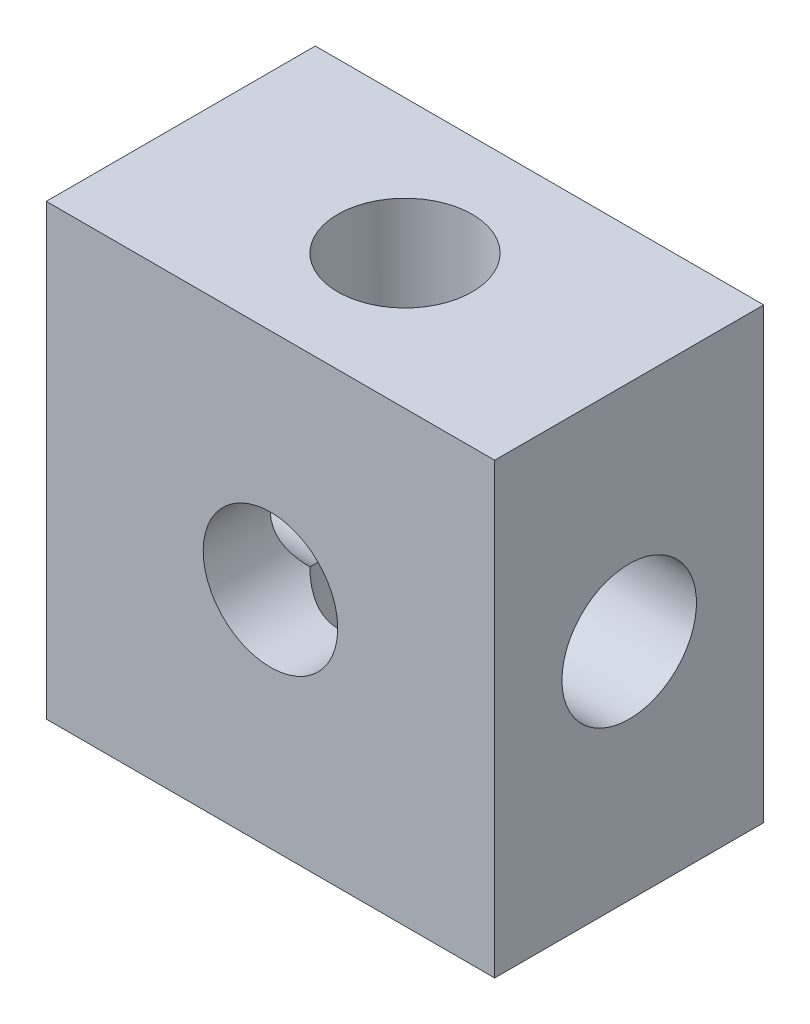
ISO-10303-21;
HEADER;
FILE_DESCRIPTION(('STEP AP214'),'2;1');
FILE_NAME('part.step','',(''),(''),'','','');
FILE_SCHEMA(('AUTOMOTIVE_DESIGN { 1 0 10303 214 1 1 1 1 }'));
ENDSEC;
DATA;
#1=APPLICATION_CONTEXT('core data for automotive mechanical design processes');
#2=APPLICATION_PROTOCOL_DEFINITION('international standard','automotive_design',2000,#1);
#3=PRODUCT_CONTEXT('',#1,'mechanical');
#4=PRODUCT('Part','Part','',(#3));
#5=PRODUCT_RELATED_PRODUCT_CATEGORY('part','',(#4));
#6=PRODUCT_DEFINITION_FORMATION('','',#4);
#7=PRODUCT_DEFINITION_CONTEXT('part definition',#1,'design');
#8=PRODUCT_DEFINITION('design','',#6,#7);
#9=PRODUCT_DEFINITION_SHAPE('','',#8);
#10=(LENGTH_UNIT() NAMED_UNIT(*) SI_UNIT(.MILLI.,.METRE.));
#11=(NAMED_UNIT(*) PLANE_ANGLE_UNIT() SI_UNIT($,.RADIAN.));
#12=(NAMED_UNIT(*) SI_UNIT($,.STERADIAN.) SOLID_ANGLE_UNIT());
#13=UNCERTAINTY_MEASURE_WITH_UNIT(LENGTH_MEASURE(1.E-05),#10,'distance_accuracy_value','');
#14=(GEOMETRIC_REPRESENTATION_CONTEXT(3) GLOBAL_UNCERTAINTY_ASSIGNED_CONTEXT((#13)) GLOBAL_UNIT_ASSIGNED_CONTEXT((#10,
#11,#12)) REPRESENTATION_CONTEXT('',''));
#15=CARTESIAN_POINT('',(0.,0.,0.));
#16=DIRECTION('',(0.,0.,1.));
#17=DIRECTION('',(1.,0.,0.));
#18=AXIS2_PLACEMENT_3D('',#15,#16,#17);
#19=CARTESIAN_POINT('',(5.,5.,6.));
#20=DIRECTION('',(0.,0.,-1.));
#21=DIRECTION('',(-1.,0.,0.));
#22=AXIS2_PLACEMENT_3D('',#19,#20,#21);
#23=CYLINDRICAL_SURFACE('',#22,1.5);
#24=CARTESIAN_POINT('',(5.,5.,0.));
#25=DIRECTION('',(0.,0.,-1.));
#26=DIRECTION('',(-1.,0.,0.));
#27=AXIS2_PLACEMENT_3D('',#24,#25,#26);
#28=CIRCLE('',#27,1.5);
#29=CARTESIAN_POINT('',(3.5,5.,0.));
#30=VERTEX_POINT('',#29);
#31=EDGE_CURVE('E155',#30,#30,#28,.T.);
#32=ORIENTED_EDGE('',*,*,#31,.T.);
#33=EDGE_LOOP('',(#32));
#34=FACE_BOUND('',#33,.T.);
#35=CARTESIAN_POINT('',(5.,5.,3.));
#36=DIRECTION('',(0.,0.707106781186547,-0.707106781186548));
#37=DIRECTION('',(0.,-0.707106781186547,-0.707106781186548));
#38=AXIS2_PLACEMENT_3D('',#35,#36,#37);
#39=ELLIPSE('',#38,2.12132034355964,1.5);
#40=CARTESIAN_POINT('',(3.93933982822018,3.93933982822018,1.93933982822018));
#41=VERTEX_POINT('',#40);
#42=CARTESIAN_POINT('',(6.06066017177982,3.93933982822018,1.93933982822018));
#43=VERTEX_POINT('',#42);
#44=EDGE_CURVE('E110',#41,#43,#39,.F.);
#45=ORIENTED_EDGE('',*,*,#44,.T.);
#46=CARTESIAN_POINT('',(5.,5.,3.));
#47=DIRECTION('',(-0.707106781186547,0.,-0.707106781186547));
#48=DIRECTION('',(0.707106781186547,0.,-0.707106781186547));
#49=AXIS2_PLACEMENT_3D('',#46,#47,#48);
#50=ELLIPSE('',#49,2.12132034355964,1.5);
#51=CARTESIAN_POINT('',(6.06066017177982,6.06066017177982,1.93933982822018));
#52=VERTEX_POINT('',#51);
#53=EDGE_CURVE('E55',#43,#52,#50,.F.);
#54=ORIENTED_EDGE('',*,*,#53,.T.);
#55=CARTESIAN_POINT('',(5.,5.,3.));
#56=DIRECTION('',(0.,-0.707106781186547,-0.707106781186548));
#57=DIRECTION('',(0.,0.707106781186547,-0.707106781186548));
#58=AXIS2_PLACEMENT_3D('',#55,#56,#57);
#59=ELLIPSE('',#58,2.12132034355964,1.5);
#60=CARTESIAN_POINT('',(3.93933982822018,6.06066017177982,1.93933982822018));
#61=VERTEX_POINT('',#60);
#62=EDGE_CURVE('E124',#52,#61,#59,.F.);
#63=ORIENTED_EDGE('',*,*,#62,.T.);
#64=CARTESIAN_POINT('',(5.,5.,3.));
#65=DIRECTION('',(0.707106781186547,0.,-0.707106781186547));
#66=DIRECTION('',(-0.707106781186547,0.,-0.707106781186547));
#67=AXIS2_PLACEMENT_3D('',#64,#65,#66);
#68=ELLIPSE('',#67,2.12132034355964,1.5);
#69=EDGE_CURVE('E138',#61,#41,#68,.F.);
#70=ORIENTED_EDGE('',*,*,#69,.T.);
#71=EDGE_LOOP('',(#45,#54,#63,#70));
#72=FACE_BOUND('',#71,.T.);
#73=ADVANCED_FACE('F39',(#34,#72),#23,.F.);
#74=CARTESIAN_POINT('',(0.,10.,6.));
#75=DIRECTION('',(1.,0.,0.));
#76=DIRECTION('',(0.,0.,-1.));
#77=AXIS2_PLACEMENT_3D('',#74,#75,#76);
#78=PLANE('',#77);
#79=CARTESIAN_POINT('',(0.,5.,3.));
#80=DIRECTION('',(-1.,0.,0.));
#81=DIRECTION('',(0.,0.,1.));
#82=AXIS2_PLACEMENT_3D('',#79,#80,#81);
#83=CIRCLE('',#82,1.5);
#84=CARTESIAN_POINT('',(0.,5.,4.5));
#85=VERTEX_POINT('',#84);
#86=EDGE_CURVE('E266',#85,#85,#83,.T.);
#87=ORIENTED_EDGE('',*,*,#86,.F.);
#88=EDGE_LOOP('',(#87));
#89=FACE_BOUND('',#88,.T.);
#90=DIRECTION('',(0.,-1.,0.));
#91=VECTOR('',#90,1.);
#92=CARTESIAN_POINT('',(0.,10.,0.));
#93=LINE('',#92,#91);
#94=CARTESIAN_POINT('',(0.,10.,0.));
#95=VERTEX_POINT('',#94);
#96=CARTESIAN_POINT('',(0.,0.,0.));
#97=VERTEX_POINT('',#96);
#98=EDGE_CURVE('E163',#95,#97,#93,.T.);
#99=ORIENTED_EDGE('',*,*,#98,.T.);
#100=DIRECTION('',(0.,0.,-1.));
#101=VECTOR('',#100,1.);
#102=CARTESIAN_POINT('',(0.,0.,6.));
#103=LINE('',#102,#101);
#104=CARTESIAN_POINT('',(0.,0.,6.));
#105=VERTEX_POINT('',#104);
#106=EDGE_CURVE('E130',#105,#97,#103,.T.);
#107=ORIENTED_EDGE('',*,*,#106,.F.);
#108=DIRECTION('',(0.,-1.,0.));
#109=VECTOR('',#108,1.);
#110=CARTESIAN_POINT('',(0.,10.,6.));
#111=LINE('',#110,#109);
#112=CARTESIAN_POINT('',(0.,10.,6.));
#113=VERTEX_POINT('',#112);
#114=EDGE_CURVE('E167',#113,#105,#111,.T.);
#115=ORIENTED_EDGE('',*,*,#114,.F.);
#116=DIRECTION('',(0.,0.,-1.));
#117=VECTOR('',#116,1.);
#118=CARTESIAN_POINT('',(0.,10.,6.));
#119=LINE('',#118,#117);
#120=EDGE_CURVE('E181',#113,#95,#119,.T.);
#121=ORIENTED_EDGE('',*,*,#120,.T.);
#122=EDGE_LOOP('',(#99,#107,#115,#121));
#123=FACE_BOUND('',#122,.T.);
#124=ADVANCED_FACE('F41',(#89,#123),#78,.F.);
#125=CARTESIAN_POINT('',(0.,0.,6.));
#126=DIRECTION('',(0.,1.,0.));
#127=DIRECTION('',(0.,0.,1.));
#128=AXIS2_PLACEMENT_3D('',#125,#126,#127);
#129=PLANE('',#128);
#130=CARTESIAN_POINT('',(5.,0.,3.));
#131=DIRECTION('',(0.,1.,0.));
#132=DIRECTION('',(-1.,0.,0.));
#133=AXIS2_PLACEMENT_3D('',#130,#131,#132);
#134=CIRCLE('',#133,1.5);
#135=CARTESIAN_POINT('',(3.5,0.,3.));
#136=VERTEX_POINT('',#135);
#137=EDGE_CURVE('E151',#136,#136,#134,.T.);
#138=ORIENTED_EDGE('',*,*,#137,.T.);
#139=EDGE_LOOP('',(#138));
#140=FACE_BOUND('',#139,.T.);
#141=DIRECTION('',(1.,0.,0.));
#142=VECTOR('',#141,1.);
#143=CARTESIAN_POINT('',(0.,0.,0.));
#144=LINE('',#143,#142);
#145=CARTESIAN_POINT('',(10.,0.,0.));
#146=VERTEX_POINT('',#145);
#147=EDGE_CURVE('E185',#97,#146,#144,.T.);
#148=ORIENTED_EDGE('',*,*,#147,.T.);
#149=DIRECTION('',(0.,0.,-1.));
#150=VECTOR('',#149,1.);
#151=CARTESIAN_POINT('',(10.,0.,6.));
#152=LINE('',#151,#150);
#153=CARTESIAN_POINT('',(10.,0.,6.));
#154=VERTEX_POINT('',#153);
#155=EDGE_CURVE('E200',#154,#146,#152,.T.);
#156=ORIENTED_EDGE('',*,*,#155,.F.);
#157=DIRECTION('',(1.,0.,0.));
#158=VECTOR('',#157,1.);
#159=CARTESIAN_POINT('',(0.,0.,6.));
#160=LINE('',#159,#158);
#161=EDGE_CURVE('E171',#105,#154,#160,.T.);
#162=ORIENTED_EDGE('',*,*,#161,.F.);
#163=ORIENTED_EDGE('',*,*,#106,.T.);
#164=EDGE_LOOP('',(#148,#156,#162,#163));
#165=FACE_BOUND('',#164,.T.);
#166=ADVANCED_FACE('F207',(#140,#165),#129,.F.);
#167=CARTESIAN_POINT('',(10.,0.,6.));
#168=DIRECTION('',(-1.,0.,0.));
#169=DIRECTION('',(0.,0.,1.));
#170=AXIS2_PLACEMENT_3D('',#167,#168,#169);
#171=PLANE('',#170);
#172=CARTESIAN_POINT('',(10.,5.,3.));
#173=DIRECTION('',(-1.,0.,0.));
#174=DIRECTION('',(0.,0.,1.));
#175=AXIS2_PLACEMENT_3D('',#172,#173,#174);
#176=CIRCLE('',#175,1.5);
#177=CARTESIAN_POINT('',(10.,5.,4.5));
#178=VERTEX_POINT('',#177);
#179=EDGE_CURVE('E120',#178,#178,#176,.T.);
#180=ORIENTED_EDGE('',*,*,#179,.T.);
#181=EDGE_LOOP('',(#180));
#182=FACE_BOUND('',#181,.T.);
#183=DIRECTION('',(0.,1.,0.));
#184=VECTOR('',#183,1.);
#185=CARTESIAN_POINT('',(10.,0.,0.));
#186=LINE('',#185,#184);
#187=CARTESIAN_POINT('',(10.,10.,0.));
#188=VERTEX_POINT('',#187);
#189=EDGE_CURVE('E188',#146,#188,#186,.T.);
#190=ORIENTED_EDGE('',*,*,#189,.T.);
#191=DIRECTION('',(0.,0.,-1.));
#192=VECTOR('',#191,1.);
#193=CARTESIAN_POINT('',(10.,10.,6.));
#194=LINE('',#193,#192);
#195=CARTESIAN_POINT('',(10.,10.,6.));
#196=VERTEX_POINT('',#195);
#197=EDGE_CURVE('E196',#196,#188,#194,.T.);
#198=ORIENTED_EDGE('',*,*,#197,.F.);
#199=DIRECTION('',(0.,1.,0.));
#200=VECTOR('',#199,1.);
#201=CARTESIAN_POINT('',(10.,0.,6.));
#202=LINE('',#201,#200);
#203=EDGE_CURVE('E175',#154,#196,#202,.T.);
#204=ORIENTED_EDGE('',*,*,#203,.F.);
#205=ORIENTED_EDGE('',*,*,#155,.T.);
#206=EDGE_LOOP('',(#190,#198,#204,#205));
#207=FACE_BOUND('',#206,.T.);
#208=ADVANCED_FACE('F219',(#182,#207),#171,.F.);
#209=CARTESIAN_POINT('',(10.,10.,6.));
#210=DIRECTION('',(0.,-1.,0.));
#211=DIRECTION('',(1.,0.,0.));
#212=AXIS2_PLACEMENT_3D('',#209,#210,#211);
#213=PLANE('',#212);
#214=CARTESIAN_POINT('',(5.,10.,3.));
#215=DIRECTION('',(0.,1.,0.));
#216=DIRECTION('',(-1.,0.,0.));
#217=AXIS2_PLACEMENT_3D('',#214,#215,#216);
#218=CIRCLE('',#217,1.5);
#219=CARTESIAN_POINT('',(3.5,10.,3.));
#220=VERTEX_POINT('',#219);
#221=EDGE_CURVE('E145',#220,#220,#218,.T.);
#222=ORIENTED_EDGE('',*,*,#221,.F.);
#223=EDGE_LOOP('',(#222));
#224=FACE_BOUND('',#223,.T.);
#225=DIRECTION('',(-1.,0.,0.));
#226=VECTOR('',#225,1.);
#227=CARTESIAN_POINT('',(10.,10.,0.));
#228=LINE('',#227,#226);
#229=EDGE_CURVE('E172',#188,#95,#228,.T.);
#230=ORIENTED_EDGE('',*,*,#229,.T.);
#231=ORIENTED_EDGE('',*,*,#120,.F.);
#232=DIRECTION('',(-1.,0.,0.));
#233=VECTOR('',#232,1.);
#234=CARTESIAN_POINT('',(10.,10.,6.));
#235=LINE('',#234,#233);
#236=EDGE_CURVE('E178',#196,#113,#235,.T.);
#237=ORIENTED_EDGE('',*,*,#236,.F.);
#238=ORIENTED_EDGE('',*,*,#197,.T.);
#239=EDGE_LOOP('',(#230,#231,#237,#238));
#240=FACE_BOUND('',#239,.T.);
#241=ADVANCED_FACE('F223',(#224,#240),#213,.F.);
#242=CARTESIAN_POINT('',(0.,0.,6.));
#243=DIRECTION('',(0.,0.,1.));
#244=DIRECTION('',(1.,0.,0.));
#245=AXIS2_PLACEMENT_3D('',#242,#243,#244);
#246=PLANE('',#245);
#247=CARTESIAN_POINT('',(5.,5.,6.));
#248=DIRECTION('',(0.,0.,-1.));
#249=DIRECTION('',(-1.,0.,0.));
#250=AXIS2_PLACEMENT_3D('',#247,#248,#249);
#251=CIRCLE('',#250,1.5);
#252=CARTESIAN_POINT('',(3.5,5.,6.));
#253=VERTEX_POINT('',#252);
#254=EDGE_CURVE('E159',#253,#253,#251,.T.);
#255=ORIENTED_EDGE('',*,*,#254,.T.);
#256=EDGE_LOOP('',(#255));
#257=FACE_BOUND('',#256,.T.);
#258=ORIENTED_EDGE('',*,*,#114,.T.);
#259=ORIENTED_EDGE('',*,*,#161,.T.);
#260=ORIENTED_EDGE('',*,*,#203,.T.);
#261=ORIENTED_EDGE('',*,*,#236,.T.);
#262=EDGE_LOOP('',(#258,#259,#260,#261));
#263=FACE_BOUND('',#262,.T.);
#264=ADVANCED_FACE('F225',(#257,#263),#246,.T.);
#265=CARTESIAN_POINT('',(0.,0.,0.));
#266=DIRECTION('',(0.,0.,1.));
#267=DIRECTION('',(1.,0.,0.));
#268=AXIS2_PLACEMENT_3D('',#265,#266,#267);
#269=PLANE('',#268);
#270=ORIENTED_EDGE('',*,*,#31,.F.);
#271=EDGE_LOOP('',(#270));
#272=FACE_BOUND('',#271,.T.);
#273=ORIENTED_EDGE('',*,*,#98,.F.);
#274=ORIENTED_EDGE('',*,*,#229,.F.);
#275=ORIENTED_EDGE('',*,*,#189,.F.);
#276=ORIENTED_EDGE('',*,*,#147,.F.);
#277=EDGE_LOOP('',(#273,#274,#275,#276));
#278=FACE_BOUND('',#277,.T.);
#279=ADVANCED_FACE('F215',(#272,#278),#269,.F.);
#280=CARTESIAN_POINT('',(5.,5.,3.));
#281=DIRECTION('',(0.,-0.707106781186547,-0.707106781186548));
#282=DIRECTION('',(0.,0.707106781186547,-0.707106781186548));
#283=AXIS2_PLACEMENT_3D('',#280,#281,#282);
#284=ELLIPSE('',#283,2.12132034355964,1.5);
#285=CARTESIAN_POINT('',(6.06066017177982,3.93933982822018,4.06066017177982));
#286=VERTEX_POINT('',#285);
#287=CARTESIAN_POINT('',(3.93933982822018,3.93933982822018,4.06066017177982));
#288=VERTEX_POINT('',#287);
#289=EDGE_CURVE('E116',#286,#288,#284,.T.);
#290=ORIENTED_EDGE('',*,*,#289,.T.);
#291=CARTESIAN_POINT('',(5.,5.,3.));
#292=DIRECTION('',(-0.707106781186547,0.,-0.707106781186547));
#293=DIRECTION('',(0.707106781186547,0.,-0.707106781186547));
#294=AXIS2_PLACEMENT_3D('',#291,#292,#293);
#295=ELLIPSE('',#294,2.12132034355964,1.5);
#296=CARTESIAN_POINT('',(3.93933982822018,6.06066017177982,4.06066017177982));
#297=VERTEX_POINT('',#296);
#298=EDGE_CURVE('E63',#288,#297,#295,.T.);
#299=ORIENTED_EDGE('',*,*,#298,.T.);
#300=CARTESIAN_POINT('',(5.,5.,3.));
#301=DIRECTION('',(0.,0.707106781186547,-0.707106781186548));
#302=DIRECTION('',(0.,-0.707106781186547,-0.707106781186548));
#303=AXIS2_PLACEMENT_3D('',#300,#301,#302);
#304=ELLIPSE('',#303,2.12132034355964,1.5);
#305=CARTESIAN_POINT('',(6.06066017177982,6.06066017177982,4.06066017177982));
#306=VERTEX_POINT('',#305);
#307=EDGE_CURVE('E118',#297,#306,#304,.T.);
#308=ORIENTED_EDGE('',*,*,#307,.T.);
#309=CARTESIAN_POINT('',(5.,5.,3.));
#310=DIRECTION('',(0.707106781186547,0.,-0.707106781186547));
#311=DIRECTION('',(-0.707106781186547,0.,-0.707106781186547));
#312=AXIS2_PLACEMENT_3D('',#309,#310,#311);
#313=ELLIPSE('',#312,2.12132034355964,1.5);
#314=EDGE_CURVE('E103',#306,#286,#313,.T.);
#315=ORIENTED_EDGE('',*,*,#314,.T.);
#316=EDGE_LOOP('',(#290,#299,#308,#315));
#317=FACE_BOUND('',#316,.T.);
#318=ORIENTED_EDGE('',*,*,#254,.F.);
#319=EDGE_LOOP('',(#318));
#320=FACE_BOUND('',#319,.T.);
#321=ADVANCED_FACE('F114',(#317,#320),#23,.F.);
#322=CARTESIAN_POINT('',(5.,0.,3.));
#323=DIRECTION('',(0.,1.,0.));
#324=DIRECTION('',(-1.,0.,0.));
#325=AXIS2_PLACEMENT_3D('',#322,#323,#324);
#326=CYLINDRICAL_SURFACE('',#325,1.5);
#327=ORIENTED_EDGE('',*,*,#221,.T.);
#328=EDGE_LOOP('',(#327));
#329=FACE_BOUND('',#328,.T.);
#330=ORIENTED_EDGE('',*,*,#62,.F.);
#331=CARTESIAN_POINT('',(5.,5.,3.));
#332=DIRECTION('',(-0.707106781186548,0.707106781186547,0.));
#333=DIRECTION('',(0.707106781186547,0.707106781186547,0.));
#334=AXIS2_PLACEMENT_3D('',#331,#332,#333);
#335=ELLIPSE('',#334,2.12132034355964,1.5);
#336=EDGE_CURVE('E147',#52,#306,#335,.F.);
#337=ORIENTED_EDGE('',*,*,#336,.T.);
#338=ORIENTED_EDGE('',*,*,#307,.F.);
#339=CARTESIAN_POINT('',(5.,5.,3.));
#340=DIRECTION('',(0.707106781186547,0.707106781186547,0.));
#341=DIRECTION('',(-0.707106781186548,0.707106781186547,0.));
#342=AXIS2_PLACEMENT_3D('',#339,#340,#341);
#343=ELLIPSE('',#342,2.12132034355964,1.5);
#344=EDGE_CURVE('E141',#297,#61,#343,.F.);
#345=ORIENTED_EDGE('',*,*,#344,.T.);
#346=EDGE_LOOP('',(#330,#337,#338,#345));
#347=FACE_BOUND('',#346,.T.);
#348=ADVANCED_FACE('F246',(#329,#347),#326,.F.);
#349=ORIENTED_EDGE('',*,*,#137,.F.);
#350=EDGE_LOOP('',(#349));
#351=FACE_BOUND('',#350,.T.);
#352=ORIENTED_EDGE('',*,*,#44,.F.);
#353=CARTESIAN_POINT('',(5.,5.,3.));
#354=DIRECTION('',(-0.707106781186548,0.707106781186547,0.));
#355=DIRECTION('',(0.707106781186547,0.707106781186547,0.));
#356=AXIS2_PLACEMENT_3D('',#353,#354,#355);
#357=ELLIPSE('',#356,2.12132034355964,1.5);
#358=EDGE_CURVE('E11',#41,#288,#357,.T.);
#359=ORIENTED_EDGE('',*,*,#358,.T.);
#360=ORIENTED_EDGE('',*,*,#289,.F.);
#361=CARTESIAN_POINT('',(5.,5.,3.));
#362=DIRECTION('',(0.707106781186547,0.707106781186547,0.));
#363=DIRECTION('',(-0.707106781186548,0.707106781186547,0.));
#364=AXIS2_PLACEMENT_3D('',#361,#362,#363);
#365=ELLIPSE('',#364,2.12132034355964,1.5);
#366=EDGE_CURVE('E48',#286,#43,#365,.T.);
#367=ORIENTED_EDGE('',*,*,#366,.T.);
#368=EDGE_LOOP('',(#352,#359,#360,#367));
#369=FACE_BOUND('',#368,.T.);
#370=ADVANCED_FACE('F122',(#351,#369),#326,.F.);
#371=CARTESIAN_POINT('',(10.,5.,3.));
#372=DIRECTION('',(-1.,0.,0.));
#373=DIRECTION('',(0.,0.,1.));
#374=AXIS2_PLACEMENT_3D('',#371,#372,#373);
#375=CYLINDRICAL_SURFACE('',#374,1.5);
#376=ORIENTED_EDGE('',*,*,#179,.F.);
#377=EDGE_LOOP('',(#376));
#378=FACE_BOUND('',#377,.T.);
#379=ORIENTED_EDGE('',*,*,#53,.F.);
#380=ORIENTED_EDGE('',*,*,#366,.F.);
#381=ORIENTED_EDGE('',*,*,#314,.F.);
#382=ORIENTED_EDGE('',*,*,#336,.F.);
#383=EDGE_LOOP('',(#379,#380,#381,#382));
#384=FACE_BOUND('',#383,.T.);
#385=ADVANCED_FACE('F102',(#378,#384),#375,.F.);
#386=ORIENTED_EDGE('',*,*,#86,.T.);
#387=EDGE_LOOP('',(#386));
#388=FACE_BOUND('',#387,.T.);
#389=ORIENTED_EDGE('',*,*,#298,.F.);
#390=ORIENTED_EDGE('',*,*,#358,.F.);
#391=ORIENTED_EDGE('',*,*,#69,.F.);
#392=ORIENTED_EDGE('',*,*,#344,.F.);
#393=EDGE_LOOP('',(#389,#390,#391,#392));
#394=FACE_BOUND('',#393,.T.);
#395=ADVANCED_FACE('F257',(#388,#394),#375,.F.);
#396=CLOSED_SHELL('',(#73,#124,#166,#208,#241,#264,#279,#321,#348,#370,#385,#395));
#397=MANIFOLD_SOLID_BREP('B2',#396);
#398=ADVANCED_BREP_SHAPE_REPRESENTATION('',(#18,#397),#14);
#399=SHAPE_DEFINITION_REPRESENTATION(#9,#398);
ENDSEC;
END-ISO-10303-21;
